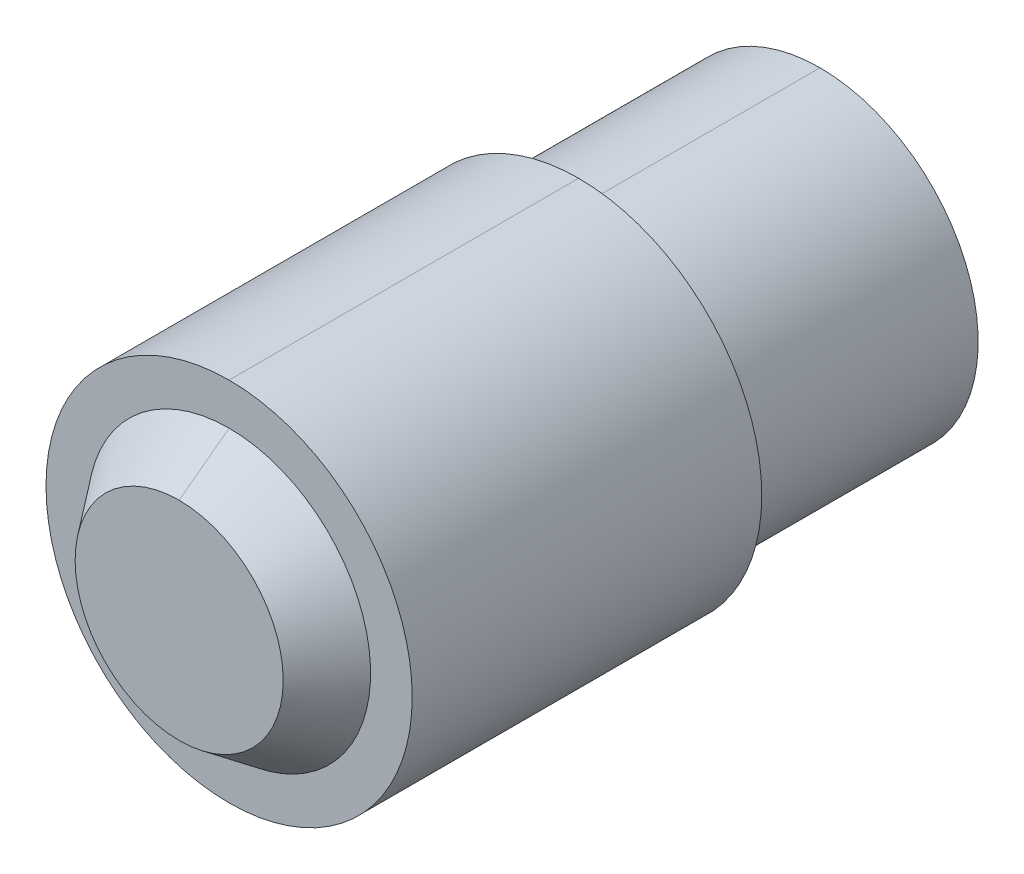
ISO-10303-21;
HEADER;
FILE_DESCRIPTION(('STEP AP214'),'2;1');
FILE_NAME('part.step','',(''),(''),'','','');
FILE_SCHEMA(('AUTOMOTIVE_DESIGN { 1 0 10303 214 1 1 1 1 }'));
ENDSEC;
DATA;
#1=APPLICATION_CONTEXT('core data for automotive mechanical design processes');
#2=APPLICATION_PROTOCOL_DEFINITION('international standard','automotive_design',2000,#1);
#3=PRODUCT_CONTEXT('',#1,'mechanical');
#4=PRODUCT('Part','Part','',(#3));
#5=PRODUCT_RELATED_PRODUCT_CATEGORY('part','',(#4));
#6=PRODUCT_DEFINITION_FORMATION('','',#4);
#7=PRODUCT_DEFINITION_CONTEXT('part definition',#1,'design');
#8=PRODUCT_DEFINITION('design','',#6,#7);
#9=PRODUCT_DEFINITION_SHAPE('','',#8);
#10=(LENGTH_UNIT() NAMED_UNIT(*) SI_UNIT(.MILLI.,.METRE.));
#11=(NAMED_UNIT(*) PLANE_ANGLE_UNIT() SI_UNIT($,.RADIAN.));
#12=(NAMED_UNIT(*) SI_UNIT($,.STERADIAN.) SOLID_ANGLE_UNIT());
#13=UNCERTAINTY_MEASURE_WITH_UNIT(LENGTH_MEASURE(1.E-05),#10,'distance_accuracy_value','');
#14=(GEOMETRIC_REPRESENTATION_CONTEXT(3) GLOBAL_UNCERTAINTY_ASSIGNED_CONTEXT((#13)) GLOBAL_UNIT_ASSIGNED_CONTEXT((#10,
#11,#12)) REPRESENTATION_CONTEXT('',''));
#15=CARTESIAN_POINT('',(0.,0.,0.));
#16=DIRECTION('',(0.,0.,1.));
#17=DIRECTION('',(1.,0.,0.));
#18=AXIS2_PLACEMENT_3D('',#15,#16,#17);
#19=CARTESIAN_POINT('',(0.,0.,0.));
#20=DIRECTION('',(0.,0.,1.));
#21=DIRECTION('',(0.,1.,0.));
#22=AXIS2_PLACEMENT_3D('',#19,#20,#21);
#23=PLANE('',#22);
#24=CARTESIAN_POINT('',(0.,0.,0.));
#25=DIRECTION('',(0.,0.,-1.));
#26=DIRECTION('',(0.,1.,0.));
#27=AXIS2_PLACEMENT_3D('',#24,#25,#26);
#28=CIRCLE('',#27,19.);
#29=CARTESIAN_POINT('',(0.,19.,0.));
#30=VERTEX_POINT('',#29);
#31=CARTESIAN_POINT('',(0.,-19.,0.));
#32=VERTEX_POINT('',#31);
#33=EDGE_CURVE('E148',#30,#32,#28,.T.);
#34=ORIENTED_EDGE('',*,*,#33,.F.);
#35=CARTESIAN_POINT('',(0.,0.,0.));
#36=DIRECTION('',(0.,0.,-1.));
#37=DIRECTION('',(0.,-1.,0.));
#38=AXIS2_PLACEMENT_3D('',#35,#36,#37);
#39=CIRCLE('',#38,19.);
#40=EDGE_CURVE('E35',#32,#30,#39,.T.);
#41=ORIENTED_EDGE('',*,*,#40,.F.);
#42=EDGE_LOOP('',(#34,#41));
#43=FACE_BOUND('',#42,.T.);
#44=CARTESIAN_POINT('',(0.,0.,0.));
#45=DIRECTION('',(0.,0.,1.));
#46=DIRECTION('',(0.,-1.,0.));
#47=AXIS2_PLACEMENT_3D('',#44,#45,#46);
#48=CIRCLE('',#47,22.);
#49=CARTESIAN_POINT('',(0.,-22.,0.));
#50=VERTEX_POINT('',#49);
#51=CARTESIAN_POINT('',(0.,22.,0.));
#52=VERTEX_POINT('',#51);
#53=EDGE_CURVE('E97',#50,#52,#48,.T.);
#54=ORIENTED_EDGE('',*,*,#53,.F.);
#55=CARTESIAN_POINT('',(0.,0.,0.));
#56=DIRECTION('',(0.,0.,-1.));
#57=DIRECTION('',(0.,-1.,0.));
#58=AXIS2_PLACEMENT_3D('',#55,#56,#57);
#59=CIRCLE('',#58,22.);
#60=EDGE_CURVE('E10',#50,#52,#59,.T.);
#61=ORIENTED_EDGE('',*,*,#60,.T.);
#62=EDGE_LOOP('',(#54,#61));
#63=FACE_BOUND('',#62,.T.);
#64=ADVANCED_FACE('F16',(#43,#63),#23,.F.);
#65=CARTESIAN_POINT('',(0.,0.,0.));
#66=DIRECTION('',(0.,0.,1.));
#67=DIRECTION('',(0.,-1.,0.));
#68=AXIS2_PLACEMENT_3D('',#65,#66,#67);
#69=CYLINDRICAL_SURFACE('',#68,19.);
#70=DIRECTION('',(0.,0.,-1.));
#71=VECTOR('',#70,1.);
#72=CARTESIAN_POINT('',(0.,-19.,0.));
#73=LINE('',#72,#71);
#74=CARTESIAN_POINT('',(0.,-19.,-29.));
#75=VERTEX_POINT('',#74);
#76=EDGE_CURVE('E20',#32,#75,#73,.T.);
#77=ORIENTED_EDGE('',*,*,#76,.T.);
#78=CARTESIAN_POINT('',(0.,0.,-29.));
#79=DIRECTION('',(0.,0.,-1.));
#80=DIRECTION('',(0.,1.,0.));
#81=AXIS2_PLACEMENT_3D('',#78,#79,#80);
#82=CIRCLE('',#81,19.);
#83=CARTESIAN_POINT('',(0.,19.,-29.));
#84=VERTEX_POINT('',#83);
#85=EDGE_CURVE('E119',#84,#75,#82,.T.);
#86=ORIENTED_EDGE('',*,*,#85,.F.);
#87=DIRECTION('',(0.,0.,-1.));
#88=VECTOR('',#87,1.);
#89=CARTESIAN_POINT('',(0.,19.,0.));
#90=LINE('',#89,#88);
#91=EDGE_CURVE('E109',#30,#84,#90,.T.);
#92=ORIENTED_EDGE('',*,*,#91,.F.);
#93=ORIENTED_EDGE('',*,*,#33,.T.);
#94=EDGE_LOOP('',(#77,#86,#92,#93));
#95=FACE_BOUND('',#94,.T.);
#96=ADVANCED_FACE('F18',(#95),#69,.T.);
#97=CARTESIAN_POINT('',(0.,0.,0.));
#98=DIRECTION('',(0.,0.,1.));
#99=DIRECTION('',(0.,-1.,0.));
#100=AXIS2_PLACEMENT_3D('',#97,#98,#99);
#101=CYLINDRICAL_SURFACE('',#100,19.);
#102=ORIENTED_EDGE('',*,*,#91,.T.);
#103=CARTESIAN_POINT('',(0.,0.,-29.));
#104=DIRECTION('',(0.,0.,-1.));
#105=DIRECTION('',(0.,-1.,0.));
#106=AXIS2_PLACEMENT_3D('',#103,#104,#105);
#107=CIRCLE('',#106,19.);
#108=EDGE_CURVE('E113',#75,#84,#107,.T.);
#109=ORIENTED_EDGE('',*,*,#108,.F.);
#110=ORIENTED_EDGE('',*,*,#76,.F.);
#111=ORIENTED_EDGE('',*,*,#40,.T.);
#112=EDGE_LOOP('',(#102,#109,#110,#111));
#113=FACE_BOUND('',#112,.T.);
#114=ADVANCED_FACE('F133',(#113),#101,.T.);
#115=CARTESIAN_POINT('',(0.,0.,-2.4));
#116=DIRECTION('',(0.,0.,-1.));
#117=DIRECTION('',(0.,1.,0.));
#118=AXIS2_PLACEMENT_3D('',#115,#116,#117);
#119=CYLINDRICAL_SURFACE('',#118,22.);
#120=ORIENTED_EDGE('',*,*,#53,.T.);
#121=DIRECTION('',(0.,0.,-1.));
#122=VECTOR('',#121,1.);
#123=CARTESIAN_POINT('',(0.,22.,42.));
#124=LINE('',#123,#122);
#125=CARTESIAN_POINT('',(0.,22.,42.));
#126=VERTEX_POINT('',#125);
#127=EDGE_CURVE('E118',#126,#52,#124,.T.);
#128=ORIENTED_EDGE('',*,*,#127,.F.);
#129=CARTESIAN_POINT('',(0.,0.,42.));
#130=DIRECTION('',(0.,0.,1.));
#131=DIRECTION('',(0.,-1.,0.));
#132=AXIS2_PLACEMENT_3D('',#129,#130,#131);
#133=CIRCLE('',#132,22.);
#134=CARTESIAN_POINT('',(0.,-22.,42.));
#135=VERTEX_POINT('',#134);
#136=EDGE_CURVE('E74',#135,#126,#133,.T.);
#137=ORIENTED_EDGE('',*,*,#136,.F.);
#138=DIRECTION('',(0.,0.,-1.));
#139=VECTOR('',#138,1.);
#140=CARTESIAN_POINT('',(0.,-22.,42.));
#141=LINE('',#140,#139);
#142=EDGE_CURVE('E100',#135,#50,#141,.T.);
#143=ORIENTED_EDGE('',*,*,#142,.T.);
#144=EDGE_LOOP('',(#120,#128,#137,#143));
#145=FACE_BOUND('',#144,.T.);
#146=ADVANCED_FACE('F135',(#145),#119,.T.);
#147=CARTESIAN_POINT('',(0.,0.,-2.4));
#148=DIRECTION('',(0.,0.,-1.));
#149=DIRECTION('',(0.,1.,0.));
#150=AXIS2_PLACEMENT_3D('',#147,#148,#149);
#151=CYLINDRICAL_SURFACE('',#150,22.);
#152=CARTESIAN_POINT('',(0.,0.,42.));
#153=DIRECTION('',(0.,0.,-1.));
#154=DIRECTION('',(0.,-1.,0.));
#155=AXIS2_PLACEMENT_3D('',#152,#153,#154);
#156=CIRCLE('',#155,22.);
#157=EDGE_CURVE('E114',#135,#126,#156,.T.);
#158=ORIENTED_EDGE('',*,*,#157,.T.);
#159=ORIENTED_EDGE('',*,*,#127,.T.);
#160=ORIENTED_EDGE('',*,*,#60,.F.);
#161=ORIENTED_EDGE('',*,*,#142,.F.);
#162=EDGE_LOOP('',(#158,#159,#160,#161));
#163=FACE_BOUND('',#162,.T.);
#164=ADVANCED_FACE('F140',(#163),#151,.T.);
#165=CARTESIAN_POINT('',(0.,0.,-29.));
#166=DIRECTION('',(0.,0.,-1.));
#167=DIRECTION('',(0.,-1.,0.));
#168=AXIS2_PLACEMENT_3D('',#165,#166,#167);
#169=PLANE('',#168);
#170=ORIENTED_EDGE('',*,*,#85,.T.);
#171=ORIENTED_EDGE('',*,*,#108,.T.);
#172=EDGE_LOOP('',(#170,#171));
#173=FACE_BOUND('',#172,.T.);
#174=ADVANCED_FACE('F129',(#173),#169,.T.);
#175=CARTESIAN_POINT('',(0.,0.,42.));
#176=DIRECTION('',(0.,0.,1.));
#177=DIRECTION('',(0.,1.,0.));
#178=AXIS2_PLACEMENT_3D('',#175,#176,#177);
#179=PLANE('',#178);
#180=ORIENTED_EDGE('',*,*,#136,.T.);
#181=ORIENTED_EDGE('',*,*,#157,.F.);
#182=EDGE_LOOP('',(#180,#181));
#183=FACE_BOUND('',#182,.T.);
#184=CARTESIAN_POINT('',(0.,0.,42.));
#185=DIRECTION('',(0.,0.,-1.));
#186=DIRECTION('',(0.,-1.,0.));
#187=AXIS2_PLACEMENT_3D('',#184,#185,#186);
#188=CIRCLE('',#187,17.);
#189=CARTESIAN_POINT('',(0.,-17.,42.));
#190=VERTEX_POINT('',#189);
#191=CARTESIAN_POINT('',(0.,17.,42.));
#192=VERTEX_POINT('',#191);
#193=EDGE_CURVE('E82',#190,#192,#188,.T.);
#194=ORIENTED_EDGE('',*,*,#193,.T.);
#195=CARTESIAN_POINT('',(0.,0.,42.));
#196=DIRECTION('',(0.,0.,1.));
#197=DIRECTION('',(0.,-1.,0.));
#198=AXIS2_PLACEMENT_3D('',#195,#196,#197);
#199=CIRCLE('',#198,17.);
#200=EDGE_CURVE('E76',#190,#192,#199,.T.);
#201=ORIENTED_EDGE('',*,*,#200,.F.);
#202=EDGE_LOOP('',(#194,#201));
#203=FACE_BOUND('',#202,.T.);
#204=ADVANCED_FACE('F83',(#183,#203),#179,.T.);
#205=CARTESIAN_POINT('',(0.,0.,63.3333333333333));
#206=DIRECTION('',(0.,0.,-1.));
#207=DIRECTION('',(0.,-1.,0.));
#208=AXIS2_PLACEMENT_3D('',#205,#206,#207);
#209=CONICAL_SURFACE('',#208,1.,0.643501108793284);
#210=CARTESIAN_POINT('',(0.,0.,48.));
#211=DIRECTION('',(0.,0.,-1.));
#212=DIRECTION('',(0.,-1.,0.));
#213=AXIS2_PLACEMENT_3D('',#210,#211,#212);
#214=CIRCLE('',#213,12.5);
#215=CARTESIAN_POINT('',(0.,-12.5,48.));
#216=VERTEX_POINT('',#215);
#217=CARTESIAN_POINT('',(0.,12.5,48.));
#218=VERTEX_POINT('',#217);
#219=EDGE_CURVE('E85',#216,#218,#214,.T.);
#220=ORIENTED_EDGE('',*,*,#219,.T.);
#221=DIRECTION('',(0.,0.6,-0.8));
#222=VECTOR('',#221,1.);
#223=CARTESIAN_POINT('',(0.,12.5,48.));
#224=LINE('',#223,#222);
#225=EDGE_CURVE('E53',#218,#192,#224,.T.);
#226=ORIENTED_EDGE('',*,*,#225,.T.);
#227=ORIENTED_EDGE('',*,*,#193,.F.);
#228=DIRECTION('',(0.,-0.6,-0.8));
#229=VECTOR('',#228,1.);
#230=CARTESIAN_POINT('',(0.,-12.5,48.));
#231=LINE('',#230,#229);
#232=EDGE_CURVE('E62',#216,#190,#231,.T.);
#233=ORIENTED_EDGE('',*,*,#232,.F.);
#234=EDGE_LOOP('',(#220,#226,#227,#233));
#235=FACE_BOUND('',#234,.T.);
#236=ADVANCED_FACE('F87',(#235),#209,.T.);
#237=CARTESIAN_POINT('',(0.,0.,63.3333333333333));
#238=DIRECTION('',(0.,0.,-1.));
#239=DIRECTION('',(0.,-1.,0.));
#240=AXIS2_PLACEMENT_3D('',#237,#238,#239);
#241=CONICAL_SURFACE('',#240,1.,0.643501108793284);
#242=ORIENTED_EDGE('',*,*,#200,.T.);
#243=ORIENTED_EDGE('',*,*,#225,.F.);
#244=CARTESIAN_POINT('',(0.,0.,48.));
#245=DIRECTION('',(0.,0.,1.));
#246=DIRECTION('',(0.,-1.,0.));
#247=AXIS2_PLACEMENT_3D('',#244,#245,#246);
#248=CIRCLE('',#247,12.5);
#249=EDGE_CURVE('E102',#216,#218,#248,.T.);
#250=ORIENTED_EDGE('',*,*,#249,.F.);
#251=ORIENTED_EDGE('',*,*,#232,.T.);
#252=EDGE_LOOP('',(#242,#243,#250,#251));
#253=FACE_BOUND('',#252,.T.);
#254=ADVANCED_FACE('F78',(#253),#241,.T.);
#255=CARTESIAN_POINT('',(0.,0.,48.));
#256=DIRECTION('',(0.,0.,1.));
#257=DIRECTION('',(0.,1.,0.));
#258=AXIS2_PLACEMENT_3D('',#255,#256,#257);
#259=PLANE('',#258);
#260=ORIENTED_EDGE('',*,*,#249,.T.);
#261=ORIENTED_EDGE('',*,*,#219,.F.);
#262=EDGE_LOOP('',(#260,#261));
#263=FACE_BOUND('',#262,.T.);
#264=ADVANCED_FACE('F222',(#263),#259,.T.);
#265=CLOSED_SHELL('',(#64,#96,#114,#146,#164,#174,#204,#236,#254,#264));
#266=MANIFOLD_SOLID_BREP('B1',#265);
#267=ADVANCED_BREP_SHAPE_REPRESENTATION('',(#18,#266),#14);
#268=SHAPE_DEFINITION_REPRESENTATION(#9,#267);
ENDSEC;
END-ISO-10303-21;
